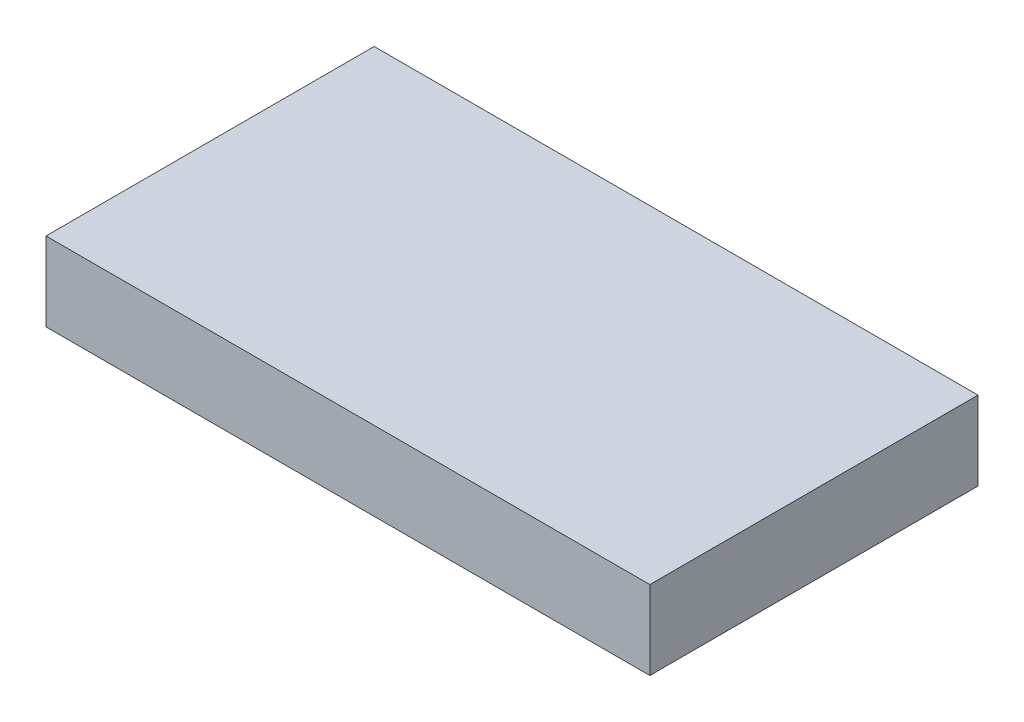
ISO-10303-21;
HEADER;
FILE_DESCRIPTION(('STEP AP214'),'2;1');
FILE_NAME('part.step','',(''),(''),'','','');
FILE_SCHEMA(('AUTOMOTIVE_DESIGN { 1 0 10303 214 1 1 1 1 }'));
ENDSEC;
DATA;
#1=APPLICATION_CONTEXT('core data for automotive mechanical design processes');
#2=APPLICATION_PROTOCOL_DEFINITION('international standard','automotive_design',2000,#1);
#3=PRODUCT_CONTEXT('',#1,'mechanical');
#4=PRODUCT('Part','Part','',(#3));
#5=PRODUCT_RELATED_PRODUCT_CATEGORY('part','',(#4));
#6=PRODUCT_DEFINITION_FORMATION('','',#4);
#7=PRODUCT_DEFINITION_CONTEXT('part definition',#1,'design');
#8=PRODUCT_DEFINITION('design','',#6,#7);
#9=PRODUCT_DEFINITION_SHAPE('','',#8);
#10=(LENGTH_UNIT() NAMED_UNIT(*) SI_UNIT(.MILLI.,.METRE.));
#11=(NAMED_UNIT(*) PLANE_ANGLE_UNIT() SI_UNIT($,.RADIAN.));
#12=(NAMED_UNIT(*) SI_UNIT($,.STERADIAN.) SOLID_ANGLE_UNIT());
#13=UNCERTAINTY_MEASURE_WITH_UNIT(LENGTH_MEASURE(1.E-05),#10,'distance_accuracy_value','');
#14=(GEOMETRIC_REPRESENTATION_CONTEXT(3) GLOBAL_UNCERTAINTY_ASSIGNED_CONTEXT((#13)) GLOBAL_UNIT_ASSIGNED_CONTEXT((#10,
#11,#12)) REPRESENTATION_CONTEXT('',''));
#15=CARTESIAN_POINT('',(0.,0.,0.));
#16=DIRECTION('',(0.,0.,1.));
#17=DIRECTION('',(1.,0.,0.));
#18=AXIS2_PLACEMENT_3D('',#15,#16,#17);
#19=CARTESIAN_POINT('',(-23.,1.5,-6.25));
#20=DIRECTION('',(0.,0.,-1.));
#21=DIRECTION('',(0.,1.,0.));
#22=AXIS2_PLACEMENT_3D('',#19,#20,#21);
#23=PLANE('',#22);
#24=DIRECTION('',(0.,1.,0.));
#25=VECTOR('',#24,1.);
#26=CARTESIAN_POINT('',(0.,1.5,-6.25));
#27=LINE('',#26,#25);
#28=CARTESIAN_POINT('',(0.,-1.5,-6.25));
#29=VERTEX_POINT('',#28);
#30=CARTESIAN_POINT('',(0.,1.5,-6.25));
#31=VERTEX_POINT('',#30);
#32=EDGE_CURVE('E97',#29,#31,#27,.T.);
#33=ORIENTED_EDGE('',*,*,#32,.F.);
#34=DIRECTION('',(1.,0.,0.));
#35=VECTOR('',#34,1.);
#36=CARTESIAN_POINT('',(-23.,-1.5,-6.25));
#37=LINE('',#36,#35);
#38=CARTESIAN_POINT('',(-23.,-1.5,-6.25));
#39=VERTEX_POINT('',#38);
#40=EDGE_CURVE('E11',#39,#29,#37,.T.);
#41=ORIENTED_EDGE('',*,*,#40,.F.);
#42=DIRECTION('',(0.,1.,0.));
#43=VECTOR('',#42,1.);
#44=CARTESIAN_POINT('',(-23.,1.5,-6.25));
#45=LINE('',#44,#43);
#46=CARTESIAN_POINT('',(-23.,1.5,-6.25));
#47=VERTEX_POINT('',#46);
#48=EDGE_CURVE('E91',#39,#47,#45,.T.);
#49=ORIENTED_EDGE('',*,*,#48,.T.);
#50=DIRECTION('',(1.,0.,0.));
#51=VECTOR('',#50,1.);
#52=CARTESIAN_POINT('',(-23.,1.5,-6.25));
#53=LINE('',#52,#51);
#54=EDGE_CURVE('E36',#47,#31,#53,.T.);
#55=ORIENTED_EDGE('',*,*,#54,.T.);
#56=EDGE_LOOP('',(#33,#41,#49,#55));
#57=FACE_BOUND('',#56,.T.);
#58=ADVANCED_FACE('F33',(#57),#23,.T.);
#59=CARTESIAN_POINT('',(-23.,-1.5,6.25));
#60=DIRECTION('',(0.,-1.,0.));
#61=DIRECTION('',(0.,0.,-1.));
#62=AXIS2_PLACEMENT_3D('',#59,#60,#61);
#63=PLANE('',#62);
#64=DIRECTION('',(0.,0.,-1.));
#65=VECTOR('',#64,1.);
#66=CARTESIAN_POINT('',(0.,-1.5,6.25));
#67=LINE('',#66,#65);
#68=CARTESIAN_POINT('',(0.,-1.5,6.25));
#69=VERTEX_POINT('',#68);
#70=EDGE_CURVE('E93',#69,#29,#67,.T.);
#71=ORIENTED_EDGE('',*,*,#70,.F.);
#72=DIRECTION('',(1.,0.,0.));
#73=VECTOR('',#72,1.);
#74=CARTESIAN_POINT('',(-23.,-1.5,6.25));
#75=LINE('',#74,#73);
#76=CARTESIAN_POINT('',(-23.,-1.5,6.25));
#77=VERTEX_POINT('',#76);
#78=EDGE_CURVE('E42',#77,#69,#75,.T.);
#79=ORIENTED_EDGE('',*,*,#78,.F.);
#80=DIRECTION('',(0.,0.,-1.));
#81=VECTOR('',#80,1.);
#82=CARTESIAN_POINT('',(-23.,-1.5,6.25));
#83=LINE('',#82,#81);
#84=EDGE_CURVE('E88',#77,#39,#83,.T.);
#85=ORIENTED_EDGE('',*,*,#84,.T.);
#86=ORIENTED_EDGE('',*,*,#40,.T.);
#87=EDGE_LOOP('',(#71,#79,#85,#86));
#88=FACE_BOUND('',#87,.T.);
#89=ADVANCED_FACE('F107',(#88),#63,.T.);
#90=CARTESIAN_POINT('',(-23.,1.5,6.25));
#91=DIRECTION('',(0.,0.,1.));
#92=DIRECTION('',(1.,0.,0.));
#93=AXIS2_PLACEMENT_3D('',#90,#91,#92);
#94=PLANE('',#93);
#95=DIRECTION('',(0.,-1.,0.));
#96=VECTOR('',#95,1.);
#97=CARTESIAN_POINT('',(0.,1.5,6.25));
#98=LINE('',#97,#96);
#99=CARTESIAN_POINT('',(0.,1.5,6.25));
#100=VERTEX_POINT('',#99);
#101=EDGE_CURVE('E83',#100,#69,#98,.T.);
#102=ORIENTED_EDGE('',*,*,#101,.F.);
#103=DIRECTION('',(1.,0.,0.));
#104=VECTOR('',#103,1.);
#105=CARTESIAN_POINT('',(-23.,1.5,6.25));
#106=LINE('',#105,#104);
#107=CARTESIAN_POINT('',(-23.,1.5,6.25));
#108=VERTEX_POINT('',#107);
#109=EDGE_CURVE('E78',#108,#100,#106,.T.);
#110=ORIENTED_EDGE('',*,*,#109,.F.);
#111=DIRECTION('',(0.,-1.,0.));
#112=VECTOR('',#111,1.);
#113=CARTESIAN_POINT('',(-23.,1.5,6.25));
#114=LINE('',#113,#112);
#115=EDGE_CURVE('E81',#108,#77,#114,.T.);
#116=ORIENTED_EDGE('',*,*,#115,.T.);
#117=ORIENTED_EDGE('',*,*,#78,.T.);
#118=EDGE_LOOP('',(#102,#110,#116,#117));
#119=FACE_BOUND('',#118,.T.);
#120=ADVANCED_FACE('F80',(#119),#94,.T.);
#121=CARTESIAN_POINT('',(-23.,1.5,6.25));
#122=DIRECTION('',(0.,1.,0.));
#123=DIRECTION('',(0.,0.,1.));
#124=AXIS2_PLACEMENT_3D('',#121,#122,#123);
#125=PLANE('',#124);
#126=DIRECTION('',(0.,0.,1.));
#127=VECTOR('',#126,1.);
#128=CARTESIAN_POINT('',(0.,1.5,6.25));
#129=LINE('',#128,#127);
#130=EDGE_CURVE('E100',#31,#100,#129,.T.);
#131=ORIENTED_EDGE('',*,*,#130,.F.);
#132=ORIENTED_EDGE('',*,*,#54,.F.);
#133=DIRECTION('',(0.,0.,1.));
#134=VECTOR('',#133,1.);
#135=CARTESIAN_POINT('',(-23.,1.5,6.25));
#136=LINE('',#135,#134);
#137=EDGE_CURVE('E87',#47,#108,#136,.T.);
#138=ORIENTED_EDGE('',*,*,#137,.T.);
#139=ORIENTED_EDGE('',*,*,#109,.T.);
#140=EDGE_LOOP('',(#131,#132,#138,#139));
#141=FACE_BOUND('',#140,.T.);
#142=ADVANCED_FACE('F90',(#141),#125,.T.);
#143=CARTESIAN_POINT('',(-23.,0.,0.));
#144=DIRECTION('',(1.,0.,0.));
#145=DIRECTION('',(0.,0.,-1.));
#146=AXIS2_PLACEMENT_3D('',#143,#144,#145);
#147=PLANE('',#146);
#148=ORIENTED_EDGE('',*,*,#48,.F.);
#149=ORIENTED_EDGE('',*,*,#84,.F.);
#150=ORIENTED_EDGE('',*,*,#115,.F.);
#151=ORIENTED_EDGE('',*,*,#137,.F.);
#152=EDGE_LOOP('',(#148,#149,#150,#151));
#153=FACE_BOUND('',#152,.T.);
#154=ADVANCED_FACE('F86',(#153),#147,.F.);
#155=CARTESIAN_POINT('',(0.,0.,0.));
#156=DIRECTION('',(1.,0.,0.));
#157=DIRECTION('',(0.,0.,-1.));
#158=AXIS2_PLACEMENT_3D('',#155,#156,#157);
#159=PLANE('',#158);
#160=ORIENTED_EDGE('',*,*,#32,.T.);
#161=ORIENTED_EDGE('',*,*,#130,.T.);
#162=ORIENTED_EDGE('',*,*,#101,.T.);
#163=ORIENTED_EDGE('',*,*,#70,.T.);
#164=EDGE_LOOP('',(#160,#161,#162,#163));
#165=FACE_BOUND('',#164,.T.);
#166=ADVANCED_FACE('F106',(#165),#159,.T.);
#167=CLOSED_SHELL('',(#58,#89,#120,#142,#154,#166));
#168=MANIFOLD_SOLID_BREP('B2',#167);
#169=ADVANCED_BREP_SHAPE_REPRESENTATION('',(#18,#168),#14);
#170=SHAPE_DEFINITION_REPRESENTATION(#9,#169);
ENDSEC;
END-ISO-10303-21;
